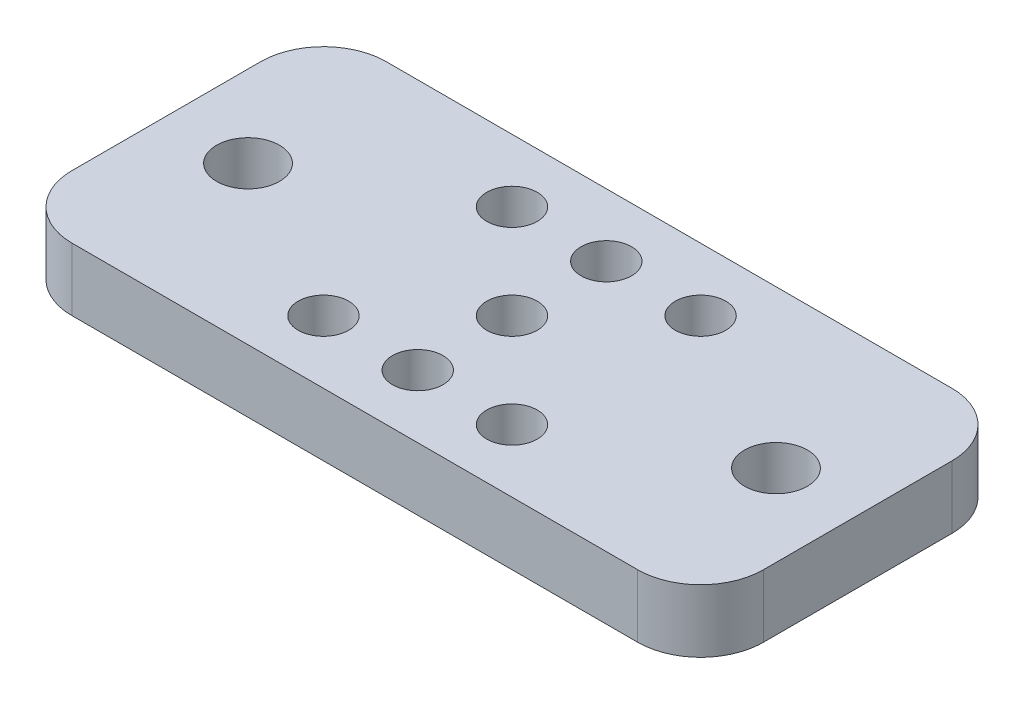
ISO-10303-21;
HEADER;
FILE_DESCRIPTION(('STEP AP214'),'2;1');
FILE_NAME('part.step','',(''),(''),'','','');
FILE_SCHEMA(('AUTOMOTIVE_DESIGN { 1 0 10303 214 1 1 1 1 }'));
ENDSEC;
DATA;
#1=APPLICATION_CONTEXT('core data for automotive mechanical design processes');
#2=APPLICATION_PROTOCOL_DEFINITION('international standard','automotive_design',2000,#1);
#3=PRODUCT_CONTEXT('',#1,'mechanical');
#4=PRODUCT('Part','Part','',(#3));
#5=PRODUCT_RELATED_PRODUCT_CATEGORY('part','',(#4));
#6=PRODUCT_DEFINITION_FORMATION('','',#4);
#7=PRODUCT_DEFINITION_CONTEXT('part definition',#1,'design');
#8=PRODUCT_DEFINITION('design','',#6,#7);
#9=PRODUCT_DEFINITION_SHAPE('','',#8);
#10=(LENGTH_UNIT() NAMED_UNIT(*) SI_UNIT(.MILLI.,.METRE.));
#11=(NAMED_UNIT(*) PLANE_ANGLE_UNIT() SI_UNIT($,.RADIAN.));
#12=(NAMED_UNIT(*) SI_UNIT($,.STERADIAN.) SOLID_ANGLE_UNIT());
#13=UNCERTAINTY_MEASURE_WITH_UNIT(LENGTH_MEASURE(1.E-05),#10,'distance_accuracy_value','');
#14=(GEOMETRIC_REPRESENTATION_CONTEXT(3) GLOBAL_UNCERTAINTY_ASSIGNED_CONTEXT((#13)) GLOBAL_UNIT_ASSIGNED_CONTEXT((#10,
#11,#12)) REPRESENTATION_CONTEXT('',''));
#15=CARTESIAN_POINT('',(0.,0.,0.));
#16=DIRECTION('',(0.,0.,1.));
#17=DIRECTION('',(1.,0.,0.));
#18=AXIS2_PLACEMENT_3D('',#15,#16,#17);
#19=CARTESIAN_POINT('',(33.0651280605346,3.175,14.0151280605346));
#20=DIRECTION('',(0.,-1.,0.));
#21=DIRECTION('',(0.,0.,-1.));
#22=AXIS2_PLACEMENT_3D('',#19,#20,#21);
#23=PLANE('',#22);
#24=CARTESIAN_POINT('',(0.,3.175,-9.525));
#25=DIRECTION('',(0.,1.,0.));
#26=DIRECTION('',(0.,0.,1.));
#27=AXIS2_PLACEMENT_3D('',#24,#25,#26);
#28=CIRCLE('',#27,2.5527);
#29=CARTESIAN_POINT('',(0.,3.175,-6.97229999999999));
#30=VERTEX_POINT('',#29);
#31=EDGE_CURVE('E335',#30,#30,#28,.T.);
#32=ORIENTED_EDGE('',*,*,#31,.F.);
#33=EDGE_LOOP('',(#32));
#34=FACE_BOUND('',#33,.T.);
#35=CARTESIAN_POINT('',(26.67,3.175,0.));
#36=DIRECTION('',(0.,1.,0.));
#37=DIRECTION('',(0.,0.,1.));
#38=AXIS2_PLACEMENT_3D('',#35,#36,#37);
#39=CIRCLE('',#38,3.175);
#40=CARTESIAN_POINT('',(26.67,3.175,3.17500000000001));
#41=VERTEX_POINT('',#40);
#42=EDGE_CURVE('E323',#41,#41,#39,.T.);
#43=ORIENTED_EDGE('',*,*,#42,.F.);
#44=EDGE_LOOP('',(#43));
#45=FACE_BOUND('',#44,.T.);
#46=CARTESIAN_POINT('',(0.,3.175,9.525));
#47=DIRECTION('',(0.,1.,0.));
#48=DIRECTION('',(0.,0.,1.));
#49=AXIS2_PLACEMENT_3D('',#46,#47,#48);
#50=CIRCLE('',#49,2.5527);
#51=CARTESIAN_POINT('',(0.,3.175,12.0777));
#52=VERTEX_POINT('',#51);
#53=EDGE_CURVE('E311',#52,#52,#50,.T.);
#54=ORIENTED_EDGE('',*,*,#53,.F.);
#55=EDGE_LOOP('',(#54));
#56=FACE_BOUND('',#55,.T.);
#57=CARTESIAN_POINT('',(-9.525,3.175,-9.525));
#58=DIRECTION('',(0.,1.,0.));
#59=DIRECTION('',(0.,0.,1.));
#60=AXIS2_PLACEMENT_3D('',#57,#58,#59);
#61=CIRCLE('',#60,2.5527);
#62=CARTESIAN_POINT('',(-9.525,3.175,-6.97229999999999));
#63=VERTEX_POINT('',#62);
#64=EDGE_CURVE('E293',#63,#63,#61,.T.);
#65=ORIENTED_EDGE('',*,*,#64,.F.);
#66=EDGE_LOOP('',(#65));
#67=FACE_BOUND('',#66,.T.);
#68=CARTESIAN_POINT('',(34.925,3.175,9.525));
#69=CARTESIAN_POINT('',(34.925,3.175,10.1073290340582));
#70=CARTESIAN_POINT('',(34.8189890894452,3.175,10.6804653828171));
#71=CARTESIAN_POINT('',(34.7067154023492,3.175,11.2874607453435));
#72=CARTESIAN_POINT('',(34.4791557117464,3.175,11.8624014057179));
#73=CARTESIAN_POINT('',(34.2424336857792,3.175,12.4604911533979));
#74=CARTESIAN_POINT('',(33.8899214962384,3.175,12.9997819339957));
#75=CARTESIAN_POINT('',(33.530435300502,3.175,13.5497418981187));
#76=CARTESIAN_POINT('',(33.0651280605346,3.175,14.0151280605346));
#77=CARTESIAN_POINT('',(32.6005781956532,3.175,14.4797567194032));
#78=CARTESIAN_POINT('',(32.0497819339956,3.175,14.8399214962384));
#79=CARTESIAN_POINT('',(31.5114282109368,3.175,15.1919501173848));
#80=CARTESIAN_POINT('',(30.9124014057179,3.175,15.4291557117464));
#81=CARTESIAN_POINT('',(30.3384696435493,3.175,15.6564240469563));
#82=CARTESIAN_POINT('',(29.7304653828171,3.175,15.7689890894453));
#83=CARTESIAN_POINT('',(29.1578623448204,3.175,15.875));
#84=CARTESIAN_POINT('',(28.575,3.175,15.875));
#85=B_SPLINE_CURVE_WITH_KNOTS('',2,(#68,#69,#70,#71,#72,#73,#74,#75,#76,#77,#78,#79,#80,#81,#82,
#83,#84),.UNSPECIFIED.,.F.,.F.,(3,2,2,2,2,2,2,2,3),(0.,0.125,0.25,0.375,0.5,0.625,0.75,0.875,
1.),.UNSPECIFIED.);
#86=CARTESIAN_POINT('',(28.575,3.175,15.875));
#87=VERTEX_POINT('',#86);
#88=CARTESIAN_POINT('',(34.925,3.175,9.525));
#89=VERTEX_POINT('',#88);
#90=EDGE_CURVE('E249',#87,#89,#85,.F.);
#91=ORIENTED_EDGE('',*,*,#90,.T.);
#92=DIRECTION('',(0.,0.,-1.));
#93=VECTOR('',#92,1.);
#94=CARTESIAN_POINT('',(34.925,3.175,9.525));
#95=LINE('',#94,#93);
#96=CARTESIAN_POINT('',(34.925,3.175,-9.525));
#97=VERTEX_POINT('',#96);
#98=EDGE_CURVE('E102',#89,#97,#95,.T.);
#99=ORIENTED_EDGE('',*,*,#98,.T.);
#100=CARTESIAN_POINT('',(28.575,3.175,-15.875));
#101=CARTESIAN_POINT('',(29.1573290340704,3.175,-15.875));
#102=CARTESIAN_POINT('',(29.7304653828171,3.175,-15.7689890894452));
#103=CARTESIAN_POINT('',(30.3374607453627,3.175,-15.6567154023432));
#104=CARTESIAN_POINT('',(30.9124014057179,3.175,-15.4291557117464));
#105=CARTESIAN_POINT('',(31.5104911533918,3.175,-15.1924336857799));
#106=CARTESIAN_POINT('',(32.0497819339956,3.175,-14.8399214962384));
#107=CARTESIAN_POINT('',(32.5997418981059,3.175,-14.4804353005138));
#108=CARTESIAN_POINT('',(33.0651280605346,3.175,-14.0151280605346));
#109=CARTESIAN_POINT('',(33.529756719404,3.175,-13.5505781956534));
#110=CARTESIAN_POINT('',(33.8899214962384,3.175,-12.9997819339956));
#111=CARTESIAN_POINT('',(34.2419501173982,3.175,-12.4614282109149));
#112=CARTESIAN_POINT('',(34.4791557117464,3.175,-11.8624014057179));
#113=CARTESIAN_POINT('',(34.7064240469659,3.175,-11.2884696435137));
#114=CARTESIAN_POINT('',(34.8189890894452,3.175,-10.6804653828171));
#115=CARTESIAN_POINT('',(34.925,3.175,-10.1078623448051));
#116=CARTESIAN_POINT('',(34.925,3.175,-9.525));
#117=B_SPLINE_CURVE_WITH_KNOTS('',2,(#100,#101,#102,#103,#104,#105,#106,#107,#108,#109,#110,
#111,#112,#113,#114,#115,#116),.UNSPECIFIED.,.F.,.F.,(3,2,2,2,2,2,2,2,3),(0.,0.125,0.25,0.375,
0.5,0.625,0.75,0.875,1.),.UNSPECIFIED.);
#118=CARTESIAN_POINT('',(28.575,3.175,-15.875));
#119=VERTEX_POINT('',#118);
#120=EDGE_CURVE('E537',#97,#119,#117,.F.);
#121=ORIENTED_EDGE('',*,*,#120,.T.);
#122=DIRECTION('',(-1.,0.,0.));
#123=VECTOR('',#122,1.);
#124=CARTESIAN_POINT('',(28.575,3.175,-15.875));
#125=LINE('',#124,#123);
#126=CARTESIAN_POINT('',(-28.575,3.175,-15.875));
#127=VERTEX_POINT('',#126);
#128=EDGE_CURVE('E538',#119,#127,#125,.T.);
#129=ORIENTED_EDGE('',*,*,#128,.T.);
#130=CARTESIAN_POINT('',(-34.925,3.175,-9.52499999999999));
#131=CARTESIAN_POINT('',(-34.925,3.175,-10.1073290340668));
#132=CARTESIAN_POINT('',(-34.8189890894453,3.175,-10.6804653828171));
#133=CARTESIAN_POINT('',(-34.7067154023421,3.175,-11.2874607453728));
#134=CARTESIAN_POINT('',(-34.4791557117464,3.175,-11.8624014057179));
#135=CARTESIAN_POINT('',(-34.2424336857704,3.175,-12.4604911534082));
#136=CARTESIAN_POINT('',(-33.8899214962384,3.175,-12.9997819339956));
#137=CARTESIAN_POINT('',(-33.5304353005061,3.175,-13.5497418981157));
#138=CARTESIAN_POINT('',(-33.0651280605346,3.175,-14.0151280605346));
#139=CARTESIAN_POINT('',(-32.6005781956552,3.175,-14.4797567194002));
#140=CARTESIAN_POINT('',(-32.0497819339956,3.175,-14.8399214962384));
#141=CARTESIAN_POINT('',(-31.5114282109292,3.175,-15.1919501173915));
#142=CARTESIAN_POINT('',(-30.9124014057179,3.175,-15.4291557117464));
#143=CARTESIAN_POINT('',(-30.3384696435195,3.175,-15.6564240469646));
#144=CARTESIAN_POINT('',(-29.7304653828171,3.175,-15.7689890894452));
#145=CARTESIAN_POINT('',(-29.1578623448062,3.175,-15.875));
#146=CARTESIAN_POINT('',(-28.575,3.175,-15.875));
#147=B_SPLINE_CURVE_WITH_KNOTS('',2,(#130,#131,#132,#133,#134,#135,#136,#137,#138,#139,#140,
#141,#142,#143,#144,#145,#146),.UNSPECIFIED.,.F.,.F.,(3,2,2,2,2,2,2,2,3),(0.,0.125,0.25,0.375,
0.5,0.625,0.75,0.875,1.),.UNSPECIFIED.);
#148=CARTESIAN_POINT('',(-34.925,3.175,-9.52499999999999));
#149=VERTEX_POINT('',#148);
#150=EDGE_CURVE('E122',#127,#149,#147,.F.);
#151=ORIENTED_EDGE('',*,*,#150,.T.);
#152=DIRECTION('',(0.,0.,1.));
#153=VECTOR('',#152,1.);
#154=CARTESIAN_POINT('',(-34.925,3.175,-9.52499999999999));
#155=LINE('',#154,#153);
#156=CARTESIAN_POINT('',(-34.925,3.175,9.52500000000001));
#157=VERTEX_POINT('',#156);
#158=EDGE_CURVE('E115',#149,#157,#155,.T.);
#159=ORIENTED_EDGE('',*,*,#158,.T.);
#160=CARTESIAN_POINT('',(-28.575,3.175,15.875));
#161=CARTESIAN_POINT('',(-29.1573290340658,3.175,15.875));
#162=CARTESIAN_POINT('',(-29.7304653828171,3.175,15.7689890894453));
#163=CARTESIAN_POINT('',(-30.3374607453494,3.175,15.6567154023466));
#164=CARTESIAN_POINT('',(-30.9124014057179,3.175,15.4291557117464));
#165=CARTESIAN_POINT('',(-31.5104911534185,3.175,15.1924336857713));
#166=CARTESIAN_POINT('',(-32.0497819339956,3.175,14.8399214962384));
#167=CARTESIAN_POINT('',(-32.5997418981382,3.175,14.4804353004836));
#168=CARTESIAN_POINT('',(-33.0651280605346,3.175,14.0151280605346));
#169=CARTESIAN_POINT('',(-33.5297567193898,3.175,13.5505781956655));
#170=CARTESIAN_POINT('',(-33.8899214962384,3.175,12.9997819339957));
#171=CARTESIAN_POINT('',(-34.2419501173998,3.175,12.4614282109219));
#172=CARTESIAN_POINT('',(-34.4791557117464,3.175,11.8624014057179));
#173=CARTESIAN_POINT('',(-34.7064240469657,3.175,11.2884696435036));
#174=CARTESIAN_POINT('',(-34.8189890894453,3.175,10.6804653828171));
#175=CARTESIAN_POINT('',(-34.925,3.175,10.1078623448156));
#176=CARTESIAN_POINT('',(-34.925,3.175,9.52500000000001));
#177=B_SPLINE_CURVE_WITH_KNOTS('',2,(#160,#161,#162,#163,#164,#165,#166,#167,#168,#169,#170,
#171,#172,#173,#174,#175,#176),.UNSPECIFIED.,.F.,.F.,(3,2,2,2,2,2,2,2,3),(0.,0.125,0.25,0.375,
0.5,0.625,0.75,0.875,1.),.UNSPECIFIED.);
#178=CARTESIAN_POINT('',(-28.575,3.175,15.875));
#179=VERTEX_POINT('',#178);
#180=EDGE_CURVE('E119',#157,#179,#177,.F.);
#181=ORIENTED_EDGE('',*,*,#180,.T.);
#182=DIRECTION('',(1.,0.,0.));
#183=VECTOR('',#182,1.);
#184=CARTESIAN_POINT('',(-28.575,3.175,15.875));
#185=LINE('',#184,#183);
#186=EDGE_CURVE('E58',#179,#87,#185,.T.);
#187=ORIENTED_EDGE('',*,*,#186,.T.);
#188=EDGE_LOOP('',(#91,#99,#121,#129,#151,#159,#181,#187));
#189=FACE_BOUND('',#188,.T.);
#190=CARTESIAN_POINT('',(-9.525,3.175,9.525));
#191=DIRECTION('',(0.,1.,0.));
#192=DIRECTION('',(0.,0.,1.));
#193=AXIS2_PLACEMENT_3D('',#190,#191,#192);
#194=CIRCLE('',#193,2.55269878731688);
#195=CARTESIAN_POINT('',(-9.525,3.175,12.0776987873169));
#196=VERTEX_POINT('',#195);
#197=EDGE_CURVE('E286',#196,#196,#194,.T.);
#198=ORIENTED_EDGE('',*,*,#197,.F.);
#199=EDGE_LOOP('',(#198));
#200=FACE_BOUND('',#199,.T.);
#201=CARTESIAN_POINT('',(-26.67,3.175,0.));
#202=DIRECTION('',(0.,1.,0.));
#203=DIRECTION('',(0.,0.,1.));
#204=AXIS2_PLACEMENT_3D('',#201,#202,#203);
#205=CIRCLE('',#204,3.175);
#206=CARTESIAN_POINT('',(-26.67,3.175,3.17500000000001));
#207=VERTEX_POINT('',#206);
#208=EDGE_CURVE('E305',#207,#207,#205,.T.);
#209=ORIENTED_EDGE('',*,*,#208,.F.);
#210=EDGE_LOOP('',(#209));
#211=FACE_BOUND('',#210,.T.);
#212=CARTESIAN_POINT('',(9.525,3.175,9.52500000000001));
#213=DIRECTION('',(0.,1.,0.));
#214=DIRECTION('',(0.,0.,1.));
#215=AXIS2_PLACEMENT_3D('',#212,#213,#214);
#216=CIRCLE('',#215,2.5527);
#217=CARTESIAN_POINT('',(9.525,3.175,12.0777));
#218=VERTEX_POINT('',#217);
#219=EDGE_CURVE('E317',#218,#218,#216,.T.);
#220=ORIENTED_EDGE('',*,*,#219,.F.);
#221=EDGE_LOOP('',(#220));
#222=FACE_BOUND('',#221,.T.);
#223=CARTESIAN_POINT('',(9.525,3.175,-9.525));
#224=DIRECTION('',(0.,1.,0.));
#225=DIRECTION('',(0.,0.,1.));
#226=AXIS2_PLACEMENT_3D('',#223,#224,#225);
#227=CIRCLE('',#226,2.5527);
#228=CARTESIAN_POINT('',(9.525,3.175,-6.97229999999999));
#229=VERTEX_POINT('',#228);
#230=EDGE_CURVE('E329',#229,#229,#227,.T.);
#231=ORIENTED_EDGE('',*,*,#230,.F.);
#232=EDGE_LOOP('',(#231));
#233=FACE_BOUND('',#232,.T.);
#234=CARTESIAN_POINT('',(0.,3.175,0.));
#235=DIRECTION('',(0.,1.,0.));
#236=DIRECTION('',(0.,0.,1.));
#237=AXIS2_PLACEMENT_3D('',#234,#235,#236);
#238=CIRCLE('',#237,2.55269999999999);
#239=CARTESIAN_POINT('',(0.,3.175,2.5527));
#240=VERTEX_POINT('',#239);
#241=EDGE_CURVE('E341',#240,#240,#238,.T.);
#242=ORIENTED_EDGE('',*,*,#241,.F.);
#243=EDGE_LOOP('',(#242));
#244=FACE_BOUND('',#243,.T.);
#245=ADVANCED_FACE('F35',(#34,#45,#56,#67,#189,#200,#211,#222,#233,#244),#23,.F.);
#246=CARTESIAN_POINT('',(33.0651280605346,-3.175,14.0151280605346));
#247=DIRECTION('',(0.,-1.,0.));
#248=DIRECTION('',(0.,0.,-1.));
#249=AXIS2_PLACEMENT_3D('',#246,#247,#248);
#250=PLANE('',#249);
#251=CARTESIAN_POINT('',(0.,-3.175,-9.525));
#252=DIRECTION('',(0.,1.,0.));
#253=DIRECTION('',(0.,0.,1.));
#254=AXIS2_PLACEMENT_3D('',#251,#252,#253);
#255=CIRCLE('',#254,2.5527);
#256=CARTESIAN_POINT('',(0.,-3.175,-6.97229999999999));
#257=VERTEX_POINT('',#256);
#258=EDGE_CURVE('E338',#257,#257,#255,.T.);
#259=ORIENTED_EDGE('',*,*,#258,.T.);
#260=EDGE_LOOP('',(#259));
#261=FACE_BOUND('',#260,.T.);
#262=CARTESIAN_POINT('',(26.67,-3.175,0.));
#263=DIRECTION('',(0.,1.,0.));
#264=DIRECTION('',(0.,0.,1.));
#265=AXIS2_PLACEMENT_3D('',#262,#263,#264);
#266=CIRCLE('',#265,3.175);
#267=CARTESIAN_POINT('',(26.67,-3.175,3.17500000000001));
#268=VERTEX_POINT('',#267);
#269=EDGE_CURVE('E326',#268,#268,#266,.T.);
#270=ORIENTED_EDGE('',*,*,#269,.T.);
#271=EDGE_LOOP('',(#270));
#272=FACE_BOUND('',#271,.T.);
#273=CARTESIAN_POINT('',(0.,-3.175,9.525));
#274=DIRECTION('',(0.,1.,0.));
#275=DIRECTION('',(0.,0.,1.));
#276=AXIS2_PLACEMENT_3D('',#273,#274,#275);
#277=CIRCLE('',#276,2.5527);
#278=CARTESIAN_POINT('',(0.,-3.175,12.0777));
#279=VERTEX_POINT('',#278);
#280=EDGE_CURVE('E314',#279,#279,#277,.T.);
#281=ORIENTED_EDGE('',*,*,#280,.T.);
#282=EDGE_LOOP('',(#281));
#283=FACE_BOUND('',#282,.T.);
#284=CARTESIAN_POINT('',(-9.525,-3.175,-9.525));
#285=DIRECTION('',(0.,1.,0.));
#286=DIRECTION('',(0.,0.,1.));
#287=AXIS2_PLACEMENT_3D('',#284,#285,#286);
#288=CIRCLE('',#287,2.5527);
#289=CARTESIAN_POINT('',(-9.525,-3.175,-6.97229999999999));
#290=VERTEX_POINT('',#289);
#291=EDGE_CURVE('E296',#290,#290,#288,.T.);
#292=ORIENTED_EDGE('',*,*,#291,.T.);
#293=EDGE_LOOP('',(#292));
#294=FACE_BOUND('',#293,.T.);
#295=CARTESIAN_POINT('',(28.575,-3.175,15.875));
#296=CARTESIAN_POINT('',(29.1578623448204,-3.175,15.875));
#297=CARTESIAN_POINT('',(29.7304653828171,-3.175,15.7689890894453));
#298=CARTESIAN_POINT('',(30.3384696435493,-3.175,15.6564240469563));
#299=CARTESIAN_POINT('',(30.9124014057179,-3.175,15.4291557117464));
#300=CARTESIAN_POINT('',(31.5114282109368,-3.175,15.1919501173848));
#301=CARTESIAN_POINT('',(32.0497819339956,-3.175,14.8399214962384));
#302=CARTESIAN_POINT('',(32.6005781956532,-3.175,14.4797567194032));
#303=CARTESIAN_POINT('',(33.0651280605346,-3.175,14.0151280605346));
#304=CARTESIAN_POINT('',(33.530435300502,-3.175,13.5497418981187));
#305=CARTESIAN_POINT('',(33.8899214962384,-3.175,12.9997819339957));
#306=CARTESIAN_POINT('',(34.2424336857792,-3.175,12.4604911533979));
#307=CARTESIAN_POINT('',(34.4791557117464,-3.175,11.8624014057179));
#308=CARTESIAN_POINT('',(34.7067154023492,-3.175,11.2874607453435));
#309=CARTESIAN_POINT('',(34.8189890894452,-3.175,10.6804653828171));
#310=CARTESIAN_POINT('',(34.925,-3.175,10.1073290340582));
#311=CARTESIAN_POINT('',(34.925,-3.175,9.525));
#312=B_SPLINE_CURVE_WITH_KNOTS('',2,(#295,#296,#297,#298,#299,#300,#301,#302,#303,#304,#305,
#306,#307,#308,#309,#310,#311),.UNSPECIFIED.,.F.,.F.,(3,2,2,2,2,2,2,2,3),(0.,0.125,0.25,0.375,
0.5,0.625,0.75,0.875,1.),.UNSPECIFIED.);
#313=CARTESIAN_POINT('',(28.575,-3.175,15.875));
#314=VERTEX_POINT('',#313);
#315=CARTESIAN_POINT('',(34.925,-3.175,9.525));
#316=VERTEX_POINT('',#315);
#317=EDGE_CURVE('E244',#314,#316,#312,.T.);
#318=ORIENTED_EDGE('',*,*,#317,.F.);
#319=DIRECTION('',(1.,0.,0.));
#320=VECTOR('',#319,1.);
#321=CARTESIAN_POINT('',(-28.575,-3.175,15.875));
#322=LINE('',#321,#320);
#323=CARTESIAN_POINT('',(-28.575,-3.175,15.875));
#324=VERTEX_POINT('',#323);
#325=EDGE_CURVE('E94',#324,#314,#322,.T.);
#326=ORIENTED_EDGE('',*,*,#325,.F.);
#327=CARTESIAN_POINT('',(-34.925,-3.175,9.52500000000001));
#328=CARTESIAN_POINT('',(-34.925,-3.175,10.1078623448156));
#329=CARTESIAN_POINT('',(-34.8189890894453,-3.175,10.6804653828171));
#330=CARTESIAN_POINT('',(-34.7064240469657,-3.175,11.2884696435036));
#331=CARTESIAN_POINT('',(-34.4791557117464,-3.175,11.8624014057179));
#332=CARTESIAN_POINT('',(-34.2419501173998,-3.175,12.4614282109219));
#333=CARTESIAN_POINT('',(-33.8899214962384,-3.175,12.9997819339957));
#334=CARTESIAN_POINT('',(-33.5297567193898,-3.175,13.5505781956655));
#335=CARTESIAN_POINT('',(-33.0651280605346,-3.175,14.0151280605346));
#336=CARTESIAN_POINT('',(-32.5997418981382,-3.175,14.4804353004836));
#337=CARTESIAN_POINT('',(-32.0497819339956,-3.175,14.8399214962384));
#338=CARTESIAN_POINT('',(-31.5104911534185,-3.175,15.1924336857713));
#339=CARTESIAN_POINT('',(-30.9124014057179,-3.175,15.4291557117464));
#340=CARTESIAN_POINT('',(-30.3374607453494,-3.175,15.6567154023466));
#341=CARTESIAN_POINT('',(-29.7304653828171,-3.175,15.7689890894453));
#342=CARTESIAN_POINT('',(-29.1573290340658,-3.175,15.875));
#343=CARTESIAN_POINT('',(-28.575,-3.175,15.875));
#344=B_SPLINE_CURVE_WITH_KNOTS('',2,(#327,#328,#329,#330,#331,#332,#333,#334,#335,#336,#337,
#338,#339,#340,#341,#342,#343),.UNSPECIFIED.,.F.,.F.,(3,2,2,2,2,2,2,2,3),(0.,0.125,0.25,0.375,
0.5,0.625,0.75,0.875,1.),.UNSPECIFIED.);
#345=CARTESIAN_POINT('',(-34.925,-3.175,9.52500000000001));
#346=VERTEX_POINT('',#345);
#347=EDGE_CURVE('E87',#346,#324,#344,.T.);
#348=ORIENTED_EDGE('',*,*,#347,.F.);
#349=DIRECTION('',(0.,0.,1.));
#350=VECTOR('',#349,1.);
#351=CARTESIAN_POINT('',(-34.925,-3.175,-9.52499999999999));
#352=LINE('',#351,#350);
#353=CARTESIAN_POINT('',(-34.925,-3.175,-9.52499999999999));
#354=VERTEX_POINT('',#353);
#355=EDGE_CURVE('E131',#354,#346,#352,.T.);
#356=ORIENTED_EDGE('',*,*,#355,.F.);
#357=CARTESIAN_POINT('',(-28.575,-3.175,-15.875));
#358=CARTESIAN_POINT('',(-29.1578623448062,-3.175,-15.875));
#359=CARTESIAN_POINT('',(-29.7304653828171,-3.175,-15.7689890894452));
#360=CARTESIAN_POINT('',(-30.3384696435195,-3.175,-15.6564240469646));
#361=CARTESIAN_POINT('',(-30.9124014057179,-3.175,-15.4291557117464));
#362=CARTESIAN_POINT('',(-31.5114282109292,-3.175,-15.1919501173915));
#363=CARTESIAN_POINT('',(-32.0497819339956,-3.175,-14.8399214962384));
#364=CARTESIAN_POINT('',(-32.6005781956552,-3.175,-14.4797567194002));
#365=CARTESIAN_POINT('',(-33.0651280605346,-3.175,-14.0151280605346));
#366=CARTESIAN_POINT('',(-33.5304353005061,-3.175,-13.5497418981157));
#367=CARTESIAN_POINT('',(-33.8899214962384,-3.175,-12.9997819339956));
#368=CARTESIAN_POINT('',(-34.2424336857704,-3.175,-12.4604911534082));
#369=CARTESIAN_POINT('',(-34.4791557117464,-3.175,-11.8624014057179));
#370=CARTESIAN_POINT('',(-34.7067154023421,-3.175,-11.2874607453728));
#371=CARTESIAN_POINT('',(-34.8189890894453,-3.175,-10.6804653828171));
#372=CARTESIAN_POINT('',(-34.925,-3.175,-10.1073290340668));
#373=CARTESIAN_POINT('',(-34.925,-3.175,-9.52499999999999));
#374=B_SPLINE_CURVE_WITH_KNOTS('',2,(#357,#358,#359,#360,#361,#362,#363,#364,#365,#366,#367,
#368,#369,#370,#371,#372,#373),.UNSPECIFIED.,.F.,.F.,(3,2,2,2,2,2,2,2,3),(0.,0.125,0.25,0.375,
0.5,0.625,0.75,0.875,1.),.UNSPECIFIED.);
#375=CARTESIAN_POINT('',(-28.575,-3.175,-15.875));
#376=VERTEX_POINT('',#375);
#377=EDGE_CURVE('E204',#376,#354,#374,.T.);
#378=ORIENTED_EDGE('',*,*,#377,.F.);
#379=DIRECTION('',(-1.,0.,0.));
#380=VECTOR('',#379,1.);
#381=CARTESIAN_POINT('',(28.575,-3.175,-15.875));
#382=LINE('',#381,#380);
#383=CARTESIAN_POINT('',(28.575,-3.175,-15.875));
#384=VERTEX_POINT('',#383);
#385=EDGE_CURVE('E208',#384,#376,#382,.T.);
#386=ORIENTED_EDGE('',*,*,#385,.F.);
#387=CARTESIAN_POINT('',(34.925,-3.175,-9.525));
#388=CARTESIAN_POINT('',(34.925,-3.175,-10.1078623448051));
#389=CARTESIAN_POINT('',(34.8189890894452,-3.175,-10.6804653828171));
#390=CARTESIAN_POINT('',(34.7064240469659,-3.175,-11.2884696435137));
#391=CARTESIAN_POINT('',(34.4791557117464,-3.175,-11.8624014057179));
#392=CARTESIAN_POINT('',(34.2419501173982,-3.175,-12.4614282109149));
#393=CARTESIAN_POINT('',(33.8899214962384,-3.175,-12.9997819339956));
#394=CARTESIAN_POINT('',(33.529756719404,-3.175,-13.5505781956534));
#395=CARTESIAN_POINT('',(33.0651280605346,-3.175,-14.0151280605346));
#396=CARTESIAN_POINT('',(32.5997418981059,-3.175,-14.4804353005138));
#397=CARTESIAN_POINT('',(32.0497819339956,-3.175,-14.8399214962384));
#398=CARTESIAN_POINT('',(31.5104911533918,-3.175,-15.1924336857799));
#399=CARTESIAN_POINT('',(30.9124014057179,-3.175,-15.4291557117464));
#400=CARTESIAN_POINT('',(30.3374607453627,-3.175,-15.6567154023432));
#401=CARTESIAN_POINT('',(29.7304653828171,-3.175,-15.7689890894452));
#402=CARTESIAN_POINT('',(29.1573290340704,-3.175,-15.875));
#403=CARTESIAN_POINT('',(28.575,-3.175,-15.875));
#404=B_SPLINE_CURVE_WITH_KNOTS('',2,(#387,#388,#389,#390,#391,#392,#393,#394,#395,#396,#397,
#398,#399,#400,#401,#402,#403),.UNSPECIFIED.,.F.,.F.,(3,2,2,2,2,2,2,2,3),(0.,0.125,0.25,0.375,
0.5,0.625,0.75,0.875,1.),.UNSPECIFIED.);
#405=CARTESIAN_POINT('',(34.925,-3.175,-9.525));
#406=VERTEX_POINT('',#405);
#407=EDGE_CURVE('E243',#406,#384,#404,.T.);
#408=ORIENTED_EDGE('',*,*,#407,.F.);
#409=DIRECTION('',(0.,0.,-1.));
#410=VECTOR('',#409,1.);
#411=CARTESIAN_POINT('',(34.925,-3.175,9.525));
#412=LINE('',#411,#410);
#413=EDGE_CURVE('E236',#316,#406,#412,.T.);
#414=ORIENTED_EDGE('',*,*,#413,.F.);
#415=EDGE_LOOP('',(#318,#326,#348,#356,#378,#386,#408,#414));
#416=FACE_BOUND('',#415,.T.);
#417=CARTESIAN_POINT('',(-9.525,-3.175,9.525));
#418=DIRECTION('',(0.,1.,0.));
#419=DIRECTION('',(0.,0.,1.));
#420=AXIS2_PLACEMENT_3D('',#417,#418,#419);
#421=CIRCLE('',#420,2.55269878731688);
#422=CARTESIAN_POINT('',(-9.525,-3.175,12.0776987873169));
#423=VERTEX_POINT('',#422);
#424=EDGE_CURVE('E288',#423,#423,#421,.T.);
#425=ORIENTED_EDGE('',*,*,#424,.T.);
#426=EDGE_LOOP('',(#425));
#427=FACE_BOUND('',#426,.T.);
#428=CARTESIAN_POINT('',(-26.67,-3.175,0.));
#429=DIRECTION('',(0.,1.,0.));
#430=DIRECTION('',(0.,0.,1.));
#431=AXIS2_PLACEMENT_3D('',#428,#429,#430);
#432=CIRCLE('',#431,3.175);
#433=CARTESIAN_POINT('',(-26.67,-3.175,3.17500000000001));
#434=VERTEX_POINT('',#433);
#435=EDGE_CURVE('E308',#434,#434,#432,.T.);
#436=ORIENTED_EDGE('',*,*,#435,.T.);
#437=EDGE_LOOP('',(#436));
#438=FACE_BOUND('',#437,.T.);
#439=CARTESIAN_POINT('',(9.525,-3.175,9.52500000000001));
#440=DIRECTION('',(0.,1.,0.));
#441=DIRECTION('',(0.,0.,1.));
#442=AXIS2_PLACEMENT_3D('',#439,#440,#441);
#443=CIRCLE('',#442,2.5527);
#444=CARTESIAN_POINT('',(9.525,-3.175,12.0777));
#445=VERTEX_POINT('',#444);
#446=EDGE_CURVE('E320',#445,#445,#443,.T.);
#447=ORIENTED_EDGE('',*,*,#446,.T.);
#448=EDGE_LOOP('',(#447));
#449=FACE_BOUND('',#448,.T.);
#450=CARTESIAN_POINT('',(9.525,-3.175,-9.525));
#451=DIRECTION('',(0.,1.,0.));
#452=DIRECTION('',(0.,0.,1.));
#453=AXIS2_PLACEMENT_3D('',#450,#451,#452);
#454=CIRCLE('',#453,2.5527);
#455=CARTESIAN_POINT('',(9.525,-3.175,-6.97229999999999));
#456=VERTEX_POINT('',#455);
#457=EDGE_CURVE('E332',#456,#456,#454,.T.);
#458=ORIENTED_EDGE('',*,*,#457,.T.);
#459=EDGE_LOOP('',(#458));
#460=FACE_BOUND('',#459,.T.);
#461=CARTESIAN_POINT('',(0.,-3.175,0.));
#462=DIRECTION('',(0.,1.,0.));
#463=DIRECTION('',(0.,0.,1.));
#464=AXIS2_PLACEMENT_3D('',#461,#462,#463);
#465=CIRCLE('',#464,2.55269999999999);
#466=CARTESIAN_POINT('',(0.,-3.175,2.5527));
#467=VERTEX_POINT('',#466);
#468=EDGE_CURVE('E344',#467,#467,#465,.T.);
#469=ORIENTED_EDGE('',*,*,#468,.T.);
#470=EDGE_LOOP('',(#469));
#471=FACE_BOUND('',#470,.T.);
#472=ADVANCED_FACE('F210',(#261,#272,#283,#294,#416,#427,#438,#449,#460,#471),#250,.T.);
#473=CARTESIAN_POINT('',(28.575,3.175,15.875));
#474=CARTESIAN_POINT('',(29.1578623448204,3.175,15.875));
#475=CARTESIAN_POINT('',(29.7304653828171,3.175,15.7689890894453));
#476=CARTESIAN_POINT('',(30.3384696435493,3.175,15.6564240469563));
#477=CARTESIAN_POINT('',(30.9124014057179,3.175,15.4291557117464));
#478=CARTESIAN_POINT('',(31.5114282109368,3.175,15.1919501173848));
#479=CARTESIAN_POINT('',(32.0497819339956,3.175,14.8399214962384));
#480=CARTESIAN_POINT('',(32.6005781956532,3.175,14.4797567194032));
#481=CARTESIAN_POINT('',(33.0651280605346,3.175,14.0151280605346));
#482=CARTESIAN_POINT('',(33.530435300502,3.175,13.5497418981187));
#483=CARTESIAN_POINT('',(33.8899214962384,3.175,12.9997819339957));
#484=CARTESIAN_POINT('',(34.2424336857792,3.175,12.4604911533979));
#485=CARTESIAN_POINT('',(34.4791557117464,3.175,11.8624014057179));
#486=CARTESIAN_POINT('',(34.7067154023492,3.175,11.2874607453435));
#487=CARTESIAN_POINT('',(34.8189890894452,3.175,10.6804653828171));
#488=CARTESIAN_POINT('',(34.925,3.175,10.1073290340582));
#489=CARTESIAN_POINT('',(34.925,3.175,9.525));
#490=B_SPLINE_CURVE_WITH_KNOTS('',2,(#473,#474,#475,#476,#477,#478,#479,#480,#481,#482,#483,
#484,#485,#486,#487,#488,#489),.UNSPECIFIED.,.F.,.F.,(3,2,2,2,2,2,2,2,3),(0.,0.125,0.25,0.375,
0.5,0.625,0.75,0.875,1.),.UNSPECIFIED.);
#491=DIRECTION('',(0.,-1.,0.));
#492=VECTOR('',#491,1.);
#493=SURFACE_OF_LINEAR_EXTRUSION('',#490,#492);
#494=ORIENTED_EDGE('',*,*,#317,.T.);
#495=DIRECTION('',(0.,-1.,0.));
#496=VECTOR('',#495,1.);
#497=CARTESIAN_POINT('',(34.925,3.175,9.525));
#498=LINE('',#497,#496);
#499=EDGE_CURVE('E11',#89,#316,#498,.T.);
#500=ORIENTED_EDGE('',*,*,#499,.F.);
#501=ORIENTED_EDGE('',*,*,#90,.F.);
#502=DIRECTION('',(0.,-1.,0.));
#503=VECTOR('',#502,1.);
#504=CARTESIAN_POINT('',(28.575,3.175,15.875));
#505=LINE('',#504,#503);
#506=EDGE_CURVE('E264',#87,#314,#505,.T.);
#507=ORIENTED_EDGE('',*,*,#506,.T.);
#508=EDGE_LOOP('',(#494,#500,#501,#507));
#509=FACE_BOUND('',#508,.T.);
#510=ADVANCED_FACE('F37',(#509),#493,.F.);
#511=CARTESIAN_POINT('',(34.925,3.175,9.525));
#512=DIRECTION('',(-1.,0.,0.));
#513=DIRECTION('',(0.,0.,1.));
#514=AXIS2_PLACEMENT_3D('',#511,#512,#513);
#515=PLANE('',#514);
#516=ORIENTED_EDGE('',*,*,#413,.T.);
#517=DIRECTION('',(0.,-1.,0.));
#518=VECTOR('',#517,1.);
#519=CARTESIAN_POINT('',(34.925,3.175,-9.525));
#520=LINE('',#519,#518);
#521=EDGE_CURVE('E49',#97,#406,#520,.T.);
#522=ORIENTED_EDGE('',*,*,#521,.F.);
#523=ORIENTED_EDGE('',*,*,#98,.F.);
#524=ORIENTED_EDGE('',*,*,#499,.T.);
#525=EDGE_LOOP('',(#516,#522,#523,#524));
#526=FACE_BOUND('',#525,.T.);
#527=ADVANCED_FACE('F481',(#526),#515,.F.);
#528=CARTESIAN_POINT('',(34.925,3.175,-9.525));
#529=CARTESIAN_POINT('',(34.925,3.175,-10.1078623448051));
#530=CARTESIAN_POINT('',(34.8189890894452,3.175,-10.6804653828171));
#531=CARTESIAN_POINT('',(34.7064240469659,3.175,-11.2884696435137));
#532=CARTESIAN_POINT('',(34.4791557117464,3.175,-11.8624014057179));
#533=CARTESIAN_POINT('',(34.2419501173982,3.175,-12.4614282109149));
#534=CARTESIAN_POINT('',(33.8899214962384,3.175,-12.9997819339956));
#535=CARTESIAN_POINT('',(33.529756719404,3.175,-13.5505781956534));
#536=CARTESIAN_POINT('',(33.0651280605346,3.175,-14.0151280605346));
#537=CARTESIAN_POINT('',(32.5997418981059,3.175,-14.4804353005138));
#538=CARTESIAN_POINT('',(32.0497819339956,3.175,-14.8399214962384));
#539=CARTESIAN_POINT('',(31.5104911533918,3.175,-15.1924336857799));
#540=CARTESIAN_POINT('',(30.9124014057179,3.175,-15.4291557117464));
#541=CARTESIAN_POINT('',(30.3374607453627,3.175,-15.6567154023432));
#542=CARTESIAN_POINT('',(29.7304653828171,3.175,-15.7689890894452));
#543=CARTESIAN_POINT('',(29.1573290340704,3.175,-15.875));
#544=CARTESIAN_POINT('',(28.575,3.175,-15.875));
#545=B_SPLINE_CURVE_WITH_KNOTS('',2,(#528,#529,#530,#531,#532,#533,#534,#535,#536,#537,#538,
#539,#540,#541,#542,#543,#544),.UNSPECIFIED.,.F.,.F.,(3,2,2,2,2,2,2,2,3),(0.,0.125,0.25,0.375,
0.5,0.625,0.75,0.875,1.),.UNSPECIFIED.);
#546=DIRECTION('',(0.,-1.,0.));
#547=VECTOR('',#546,1.);
#548=SURFACE_OF_LINEAR_EXTRUSION('',#545,#547);
#549=ORIENTED_EDGE('',*,*,#407,.T.);
#550=DIRECTION('',(0.,-1.,0.));
#551=VECTOR('',#550,1.);
#552=CARTESIAN_POINT('',(28.575,3.175,-15.875));
#553=LINE('',#552,#551);
#554=EDGE_CURVE('E530',#119,#384,#553,.T.);
#555=ORIENTED_EDGE('',*,*,#554,.F.);
#556=ORIENTED_EDGE('',*,*,#120,.F.);
#557=ORIENTED_EDGE('',*,*,#521,.T.);
#558=EDGE_LOOP('',(#549,#555,#556,#557));
#559=FACE_BOUND('',#558,.T.);
#560=ADVANCED_FACE('F472',(#559),#548,.F.);
#561=CARTESIAN_POINT('',(28.575,3.175,-15.875));
#562=DIRECTION('',(0.,0.,1.));
#563=DIRECTION('',(1.,0.,0.));
#564=AXIS2_PLACEMENT_3D('',#561,#562,#563);
#565=PLANE('',#564);
#566=ORIENTED_EDGE('',*,*,#385,.T.);
#567=DIRECTION('',(0.,-1.,0.));
#568=VECTOR('',#567,1.);
#569=CARTESIAN_POINT('',(-28.575,3.175,-15.875));
#570=LINE('',#569,#568);
#571=EDGE_CURVE('E532',#127,#376,#570,.T.);
#572=ORIENTED_EDGE('',*,*,#571,.F.);
#573=ORIENTED_EDGE('',*,*,#128,.F.);
#574=ORIENTED_EDGE('',*,*,#554,.T.);
#575=EDGE_LOOP('',(#566,#572,#573,#574));
#576=FACE_BOUND('',#575,.T.);
#577=ADVANCED_FACE('F180',(#576),#565,.F.);
#578=CARTESIAN_POINT('',(-28.575,3.175,-15.875));
#579=CARTESIAN_POINT('',(-29.1578623448062,3.175,-15.875));
#580=CARTESIAN_POINT('',(-29.7304653828171,3.175,-15.7689890894452));
#581=CARTESIAN_POINT('',(-30.3384696435195,3.175,-15.6564240469646));
#582=CARTESIAN_POINT('',(-30.9124014057179,3.175,-15.4291557117464));
#583=CARTESIAN_POINT('',(-31.5114282109292,3.175,-15.1919501173915));
#584=CARTESIAN_POINT('',(-32.0497819339956,3.175,-14.8399214962384));
#585=CARTESIAN_POINT('',(-32.6005781956552,3.175,-14.4797567194002));
#586=CARTESIAN_POINT('',(-33.0651280605346,3.175,-14.0151280605346));
#587=CARTESIAN_POINT('',(-33.5304353005061,3.175,-13.5497418981157));
#588=CARTESIAN_POINT('',(-33.8899214962384,3.175,-12.9997819339956));
#589=CARTESIAN_POINT('',(-34.2424336857704,3.175,-12.4604911534082));
#590=CARTESIAN_POINT('',(-34.4791557117464,3.175,-11.8624014057179));
#591=CARTESIAN_POINT('',(-34.7067154023421,3.175,-11.2874607453728));
#592=CARTESIAN_POINT('',(-34.8189890894453,3.175,-10.6804653828171));
#593=CARTESIAN_POINT('',(-34.925,3.175,-10.1073290340668));
#594=CARTESIAN_POINT('',(-34.925,3.175,-9.52499999999999));
#595=B_SPLINE_CURVE_WITH_KNOTS('',2,(#578,#579,#580,#581,#582,#583,#584,#585,#586,#587,#588,
#589,#590,#591,#592,#593,#594),.UNSPECIFIED.,.F.,.F.,(3,2,2,2,2,2,2,2,3),(0.,0.125,0.25,0.375,
0.5,0.625,0.75,0.875,1.),.UNSPECIFIED.);
#596=DIRECTION('',(0.,-1.,0.));
#597=VECTOR('',#596,1.);
#598=SURFACE_OF_LINEAR_EXTRUSION('',#595,#597);
#599=ORIENTED_EDGE('',*,*,#377,.T.);
#600=DIRECTION('',(0.,-1.,0.));
#601=VECTOR('',#600,1.);
#602=CARTESIAN_POINT('',(-34.925,3.175,-9.52499999999999));
#603=LINE('',#602,#601);
#604=EDGE_CURVE('E132',#149,#354,#603,.T.);
#605=ORIENTED_EDGE('',*,*,#604,.F.);
#606=ORIENTED_EDGE('',*,*,#150,.F.);
#607=ORIENTED_EDGE('',*,*,#571,.T.);
#608=EDGE_LOOP('',(#599,#605,#606,#607));
#609=FACE_BOUND('',#608,.T.);
#610=ADVANCED_FACE('F176',(#609),#598,.F.);
#611=CARTESIAN_POINT('',(-34.925,3.175,-9.52499999999999));
#612=DIRECTION('',(1.,0.,0.));
#613=DIRECTION('',(0.,0.,-1.));
#614=AXIS2_PLACEMENT_3D('',#611,#612,#613);
#615=PLANE('',#614);
#616=ORIENTED_EDGE('',*,*,#355,.T.);
#617=DIRECTION('',(0.,-1.,0.));
#618=VECTOR('',#617,1.);
#619=CARTESIAN_POINT('',(-34.925,3.175,9.52500000000001));
#620=LINE('',#619,#618);
#621=EDGE_CURVE('E128',#157,#346,#620,.T.);
#622=ORIENTED_EDGE('',*,*,#621,.F.);
#623=ORIENTED_EDGE('',*,*,#158,.F.);
#624=ORIENTED_EDGE('',*,*,#604,.T.);
#625=EDGE_LOOP('',(#616,#622,#623,#624));
#626=FACE_BOUND('',#625,.T.);
#627=ADVANCED_FACE('F129',(#626),#615,.F.);
#628=CARTESIAN_POINT('',(-34.925,3.175,9.52500000000001));
#629=CARTESIAN_POINT('',(-34.925,3.175,10.1078623448156));
#630=CARTESIAN_POINT('',(-34.8189890894453,3.175,10.6804653828171));
#631=CARTESIAN_POINT('',(-34.7064240469657,3.175,11.2884696435036));
#632=CARTESIAN_POINT('',(-34.4791557117464,3.175,11.8624014057179));
#633=CARTESIAN_POINT('',(-34.2419501173998,3.175,12.4614282109219));
#634=CARTESIAN_POINT('',(-33.8899214962384,3.175,12.9997819339957));
#635=CARTESIAN_POINT('',(-33.5297567193898,3.175,13.5505781956655));
#636=CARTESIAN_POINT('',(-33.0651280605346,3.175,14.0151280605346));
#637=CARTESIAN_POINT('',(-32.5997418981382,3.175,14.4804353004836));
#638=CARTESIAN_POINT('',(-32.0497819339956,3.175,14.8399214962384));
#639=CARTESIAN_POINT('',(-31.5104911534185,3.175,15.1924336857713));
#640=CARTESIAN_POINT('',(-30.9124014057179,3.175,15.4291557117464));
#641=CARTESIAN_POINT('',(-30.3374607453494,3.175,15.6567154023466));
#642=CARTESIAN_POINT('',(-29.7304653828171,3.175,15.7689890894453));
#643=CARTESIAN_POINT('',(-29.1573290340658,3.175,15.875));
#644=CARTESIAN_POINT('',(-28.575,3.175,15.875));
#645=B_SPLINE_CURVE_WITH_KNOTS('',2,(#628,#629,#630,#631,#632,#633,#634,#635,#636,#637,#638,
#639,#640,#641,#642,#643,#644),.UNSPECIFIED.,.F.,.F.,(3,2,2,2,2,2,2,2,3),(0.,0.125,0.25,0.375,
0.5,0.625,0.75,0.875,1.),.UNSPECIFIED.);
#646=DIRECTION('',(0.,-1.,0.));
#647=VECTOR('',#646,1.);
#648=SURFACE_OF_LINEAR_EXTRUSION('',#645,#647);
#649=ORIENTED_EDGE('',*,*,#347,.T.);
#650=DIRECTION('',(0.,-1.,0.));
#651=VECTOR('',#650,1.);
#652=CARTESIAN_POINT('',(-28.575,3.175,15.875));
#653=LINE('',#652,#651);
#654=EDGE_CURVE('E133',#179,#324,#653,.T.);
#655=ORIENTED_EDGE('',*,*,#654,.F.);
#656=ORIENTED_EDGE('',*,*,#180,.F.);
#657=ORIENTED_EDGE('',*,*,#621,.T.);
#658=EDGE_LOOP('',(#649,#655,#656,#657));
#659=FACE_BOUND('',#658,.T.);
#660=ADVANCED_FACE('F136',(#659),#648,.F.);
#661=CARTESIAN_POINT('',(-28.575,3.175,15.875));
#662=DIRECTION('',(0.,0.,-1.));
#663=DIRECTION('',(-1.,0.,0.));
#664=AXIS2_PLACEMENT_3D('',#661,#662,#663);
#665=PLANE('',#664);
#666=ORIENTED_EDGE('',*,*,#325,.T.);
#667=ORIENTED_EDGE('',*,*,#506,.F.);
#668=ORIENTED_EDGE('',*,*,#186,.F.);
#669=ORIENTED_EDGE('',*,*,#654,.T.);
#670=EDGE_LOOP('',(#666,#667,#668,#669));
#671=FACE_BOUND('',#670,.T.);
#672=ADVANCED_FACE('F156',(#671),#665,.F.);
#673=CARTESIAN_POINT('',(-9.525,3.175,9.525));
#674=DIRECTION('',(0.,-1.,0.));
#675=DIRECTION('',(0.,0.,-1.));
#676=AXIS2_PLACEMENT_3D('',#673,#674,#675);
#677=CYLINDRICAL_SURFACE('',#676,2.55269878731688);
#678=ORIENTED_EDGE('',*,*,#197,.T.);
#679=EDGE_LOOP('',(#678));
#680=FACE_BOUND('',#679,.T.);
#681=ORIENTED_EDGE('',*,*,#424,.F.);
#682=EDGE_LOOP('',(#681));
#683=FACE_BOUND('',#682,.T.);
#684=ADVANCED_FACE('F369',(#680,#683),#677,.F.);
#685=CARTESIAN_POINT('',(-9.525,3.175,-9.525));
#686=DIRECTION('',(0.,-1.,0.));
#687=DIRECTION('',(0.,0.,-1.));
#688=AXIS2_PLACEMENT_3D('',#685,#686,#687);
#689=CYLINDRICAL_SURFACE('',#688,2.5527);
#690=ORIENTED_EDGE('',*,*,#64,.T.);
#691=EDGE_LOOP('',(#690));
#692=FACE_BOUND('',#691,.T.);
#693=ORIENTED_EDGE('',*,*,#291,.F.);
#694=EDGE_LOOP('',(#693));
#695=FACE_BOUND('',#694,.T.);
#696=ADVANCED_FACE('F365',(#692,#695),#689,.F.);
#697=CARTESIAN_POINT('',(-26.67,3.175,0.));
#698=DIRECTION('',(0.,-1.,0.));
#699=DIRECTION('',(0.,0.,-1.));
#700=AXIS2_PLACEMENT_3D('',#697,#698,#699);
#701=CYLINDRICAL_SURFACE('',#700,3.175);
#702=ORIENTED_EDGE('',*,*,#208,.T.);
#703=EDGE_LOOP('',(#702));
#704=FACE_BOUND('',#703,.T.);
#705=ORIENTED_EDGE('',*,*,#435,.F.);
#706=EDGE_LOOP('',(#705));
#707=FACE_BOUND('',#706,.T.);
#708=ADVANCED_FACE('F368',(#704,#707),#701,.F.);
#709=CARTESIAN_POINT('',(0.,3.175,9.525));
#710=DIRECTION('',(0.,-1.,0.));
#711=DIRECTION('',(0.,0.,-1.));
#712=AXIS2_PLACEMENT_3D('',#709,#710,#711);
#713=CYLINDRICAL_SURFACE('',#712,2.5527);
#714=ORIENTED_EDGE('',*,*,#53,.T.);
#715=EDGE_LOOP('',(#714));
#716=FACE_BOUND('',#715,.T.);
#717=ORIENTED_EDGE('',*,*,#280,.F.);
#718=EDGE_LOOP('',(#717));
#719=FACE_BOUND('',#718,.T.);
#720=ADVANCED_FACE('F377',(#716,#719),#713,.F.);
#721=CARTESIAN_POINT('',(9.525,3.175,9.52500000000001));
#722=DIRECTION('',(0.,-1.,0.));
#723=DIRECTION('',(0.,0.,-1.));
#724=AXIS2_PLACEMENT_3D('',#721,#722,#723);
#725=CYLINDRICAL_SURFACE('',#724,2.5527);
#726=ORIENTED_EDGE('',*,*,#219,.T.);
#727=EDGE_LOOP('',(#726));
#728=FACE_BOUND('',#727,.T.);
#729=ORIENTED_EDGE('',*,*,#446,.F.);
#730=EDGE_LOOP('',(#729));
#731=FACE_BOUND('',#730,.T.);
#732=ADVANCED_FACE('F383',(#728,#731),#725,.F.);
#733=CARTESIAN_POINT('',(26.67,3.175,0.));
#734=DIRECTION('',(0.,-1.,0.));
#735=DIRECTION('',(0.,0.,-1.));
#736=AXIS2_PLACEMENT_3D('',#733,#734,#735);
#737=CYLINDRICAL_SURFACE('',#736,3.175);
#738=ORIENTED_EDGE('',*,*,#42,.T.);
#739=EDGE_LOOP('',(#738));
#740=FACE_BOUND('',#739,.T.);
#741=ORIENTED_EDGE('',*,*,#269,.F.);
#742=EDGE_LOOP('',(#741));
#743=FACE_BOUND('',#742,.T.);
#744=ADVANCED_FACE('F387',(#740,#743),#737,.F.);
#745=CARTESIAN_POINT('',(9.525,3.175,-9.525));
#746=DIRECTION('',(0.,-1.,0.));
#747=DIRECTION('',(0.,0.,-1.));
#748=AXIS2_PLACEMENT_3D('',#745,#746,#747);
#749=CYLINDRICAL_SURFACE('',#748,2.5527);
#750=ORIENTED_EDGE('',*,*,#230,.T.);
#751=EDGE_LOOP('',(#750));
#752=FACE_BOUND('',#751,.T.);
#753=ORIENTED_EDGE('',*,*,#457,.F.);
#754=EDGE_LOOP('',(#753));
#755=FACE_BOUND('',#754,.T.);
#756=ADVANCED_FACE('F391',(#752,#755),#749,.F.);
#757=CARTESIAN_POINT('',(0.,3.175,-9.525));
#758=DIRECTION('',(0.,-1.,0.));
#759=DIRECTION('',(0.,0.,-1.));
#760=AXIS2_PLACEMENT_3D('',#757,#758,#759);
#761=CYLINDRICAL_SURFACE('',#760,2.5527);
#762=ORIENTED_EDGE('',*,*,#31,.T.);
#763=EDGE_LOOP('',(#762));
#764=FACE_BOUND('',#763,.T.);
#765=ORIENTED_EDGE('',*,*,#258,.F.);
#766=EDGE_LOOP('',(#765));
#767=FACE_BOUND('',#766,.T.);
#768=ADVANCED_FACE('F395',(#764,#767),#761,.F.);
#769=CARTESIAN_POINT('',(0.,3.175,0.));
#770=DIRECTION('',(0.,-1.,0.));
#771=DIRECTION('',(0.,0.,-1.));
#772=AXIS2_PLACEMENT_3D('',#769,#770,#771);
#773=CYLINDRICAL_SURFACE('',#772,2.55269999999999);
#774=ORIENTED_EDGE('',*,*,#241,.T.);
#775=EDGE_LOOP('',(#774));
#776=FACE_BOUND('',#775,.T.);
#777=ORIENTED_EDGE('',*,*,#468,.F.);
#778=EDGE_LOOP('',(#777));
#779=FACE_BOUND('',#778,.T.);
#780=ADVANCED_FACE('F350',(#776,#779),#773,.F.);
#781=CLOSED_SHELL('',(#245,#472,#510,#527,#560,#577,#610,#627,#660,#672,#684,#696,#708,#720,
#732,#744,#756,#768,#780));
#782=MANIFOLD_SOLID_BREP('B2',#781);
#783=ADVANCED_BREP_SHAPE_REPRESENTATION('',(#18,#782),#14);
#784=SHAPE_DEFINITION_REPRESENTATION(#9,#783);
ENDSEC;
END-ISO-10303-21;
